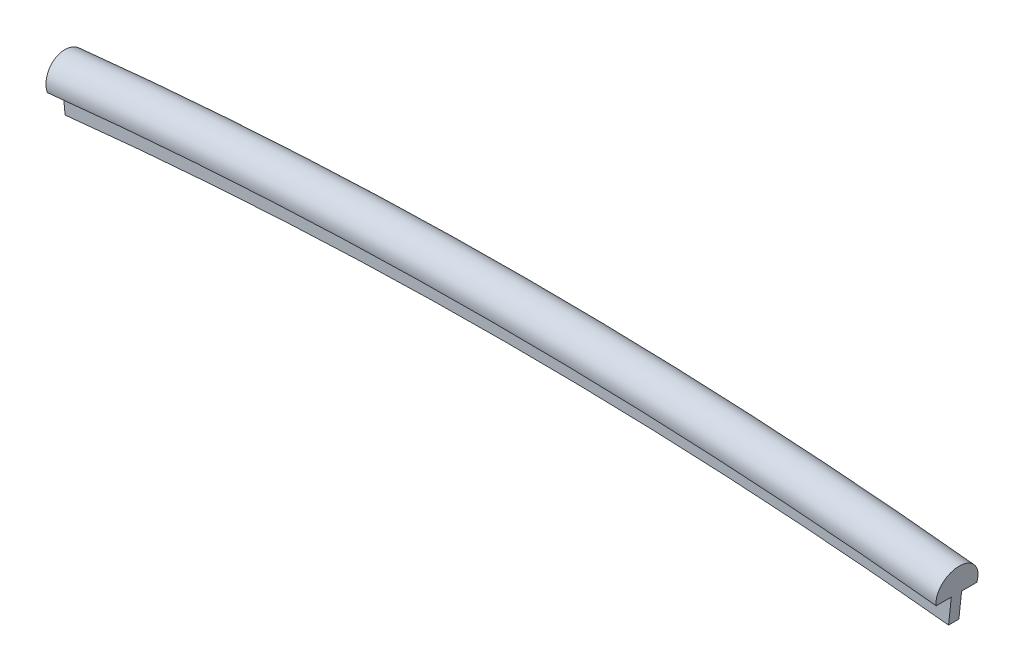
ISO-10303-21;
HEADER;
FILE_DESCRIPTION(('STEP AP214'),'2;1');
FILE_NAME('part.step','',(''),(''),'','','');
FILE_SCHEMA(('AUTOMOTIVE_DESIGN { 1 0 10303 214 1 1 1 1 }'));
ENDSEC;
DATA;
#1=APPLICATION_CONTEXT('core data for automotive mechanical design processes');
#2=APPLICATION_PROTOCOL_DEFINITION('international standard','automotive_design',2000,#1);
#3=PRODUCT_CONTEXT('',#1,'mechanical');
#4=PRODUCT('Part','Part','',(#3));
#5=PRODUCT_RELATED_PRODUCT_CATEGORY('part','',(#4));
#6=PRODUCT_DEFINITION_FORMATION('','',#4);
#7=PRODUCT_DEFINITION_CONTEXT('part definition',#1,'design');
#8=PRODUCT_DEFINITION('design','',#6,#7);
#9=PRODUCT_DEFINITION_SHAPE('','',#8);
#10=(LENGTH_UNIT() NAMED_UNIT(*) SI_UNIT(.MILLI.,.METRE.));
#11=(NAMED_UNIT(*) PLANE_ANGLE_UNIT() SI_UNIT($,.RADIAN.));
#12=(NAMED_UNIT(*) SI_UNIT($,.STERADIAN.) SOLID_ANGLE_UNIT());
#13=UNCERTAINTY_MEASURE_WITH_UNIT(LENGTH_MEASURE(1.E-05),#10,'distance_accuracy_value','');
#14=(GEOMETRIC_REPRESENTATION_CONTEXT(3) GLOBAL_UNCERTAINTY_ASSIGNED_CONTEXT((#13)) GLOBAL_UNIT_ASSIGNED_CONTEXT((#10,
#11,#12)) REPRESENTATION_CONTEXT('',''));
#15=CARTESIAN_POINT('',(0.,0.,0.));
#16=DIRECTION('',(0.,0.,1.));
#17=DIRECTION('',(1.,0.,0.));
#18=AXIS2_PLACEMENT_3D('',#15,#16,#17);
#19=CARTESIAN_POINT('',(0.,0.,70.5976415970385));
#20=DIRECTION('',(0.,0.,1.));
#21=DIRECTION('',(1.,0.,0.));
#22=AXIS2_PLACEMENT_3D('',#19,#20,#21);
#23=CYLINDRICAL_SURFACE('',#22,241.3);
#24=CARTESIAN_POINT('',(0.,0.,1.18));
#25=DIRECTION('',(0.,0.,1.));
#26=DIRECTION('',(1.,0.,0.));
#27=AXIS2_PLACEMENT_3D('',#24,#25,#26);
#28=CIRCLE('',#27,241.3);
#29=CARTESIAN_POINT('',(25.8304336729898,239.913481689265,1.18));
#30=VERTEX_POINT('',#29);
#31=CARTESIAN_POINT('',(-25.8304336729898,239.913481689265,1.18));
#32=VERTEX_POINT('',#31);
#33=EDGE_CURVE('E11',#30,#32,#28,.T.);
#34=ORIENTED_EDGE('',*,*,#33,.T.);
#35=DIRECTION('',(0.,0.,-1.));
#36=VECTOR('',#35,1.);
#37=CARTESIAN_POINT('',(-25.8304336729898,239.913481689265,1.18));
#38=LINE('',#37,#36);
#39=CARTESIAN_POINT('',(-25.8304336729898,239.913481689265,0.3));
#40=VERTEX_POINT('',#39);
#41=EDGE_CURVE('E103',#32,#40,#38,.T.);
#42=ORIENTED_EDGE('',*,*,#41,.T.);
#43=CARTESIAN_POINT('',(0.,0.,0.299999999999995));
#44=DIRECTION('',(0.,0.,1.));
#45=DIRECTION('',(1.,0.,0.));
#46=AXIS2_PLACEMENT_3D('',#43,#44,#45);
#47=CIRCLE('',#46,241.3);
#48=CARTESIAN_POINT('',(25.8304336729898,239.913481689265,0.3));
#49=VERTEX_POINT('',#48);
#50=EDGE_CURVE('E85',#49,#40,#47,.T.);
#51=ORIENTED_EDGE('',*,*,#50,.F.);
#52=DIRECTION('',(0.,0.,-1.));
#53=VECTOR('',#52,1.);
#54=CARTESIAN_POINT('',(25.8304336729898,239.913481689265,1.18));
#55=LINE('',#54,#53);
#56=EDGE_CURVE('E117',#30,#49,#55,.T.);
#57=ORIENTED_EDGE('',*,*,#56,.F.);
#58=EDGE_LOOP('',(#34,#42,#51,#57));
#59=FACE_BOUND('',#58,.T.);
#60=ADVANCED_FACE('F33',(#59),#23,.F.);
#61=CARTESIAN_POINT('',(0.,0.,0.));
#62=DIRECTION('',(0.,0.,1.));
#63=DIRECTION('',(1.,0.,0.));
#64=AXIS2_PLACEMENT_3D('',#61,#62,#63);
#65=TOROIDAL_SURFACE('',#64,241.586013989906,1.21416802890791);
#66=CARTESIAN_POINT('',(0.,0.,-1.18));
#67=DIRECTION('',(0.,0.,1.));
#68=DIRECTION('',(1.,0.,0.));
#69=AXIS2_PLACEMENT_3D('',#66,#67,#68);
#70=CIRCLE('',#69,241.3);
#71=CARTESIAN_POINT('',(25.8304336729898,239.913481689265,-1.18));
#72=VERTEX_POINT('',#71);
#73=CARTESIAN_POINT('',(-25.8304336729898,239.913481689265,-1.18));
#74=VERTEX_POINT('',#73);
#75=EDGE_CURVE('E41',#72,#74,#70,.T.);
#76=ORIENTED_EDGE('',*,*,#75,.T.);
#77=CARTESIAN_POINT('',(-25.8610506037641,240.197852232697,0.));
#78=DIRECTION('',(0.994253964729652,0.107046969220845,0.));
#79=DIRECTION('',(0.,0.,1.));
#80=AXIS2_PLACEMENT_3D('',#77,#78,#79);
#81=CIRCLE('',#80,1.21416802890791);
#82=EDGE_CURVE('E115',#74,#32,#81,.T.);
#83=ORIENTED_EDGE('',*,*,#82,.T.);
#84=ORIENTED_EDGE('',*,*,#33,.F.);
#85=CARTESIAN_POINT('',(25.8610506037641,240.197852232697,0.));
#86=DIRECTION('',(0.994253964729652,-0.107046969220845,0.));
#87=DIRECTION('',(0.,0.,1.));
#88=AXIS2_PLACEMENT_3D('',#85,#86,#87);
#89=CIRCLE('',#88,1.21416802890791);
#90=EDGE_CURVE('E97',#72,#30,#89,.T.);
#91=ORIENTED_EDGE('',*,*,#90,.F.);
#92=EDGE_LOOP('',(#76,#83,#84,#91));
#93=FACE_BOUND('',#92,.T.);
#94=ADVANCED_FACE('F35',(#93),#65,.T.);
#95=CARTESIAN_POINT('',(0.,0.,70.5976415970385));
#96=DIRECTION('',(0.,0.,1.));
#97=DIRECTION('',(1.,0.,0.));
#98=AXIS2_PLACEMENT_3D('',#95,#96,#97);
#99=CYLINDRICAL_SURFACE('',#98,241.3);
#100=CARTESIAN_POINT('',(0.,0.,-0.299999999999995));
#101=DIRECTION('',(0.,0.,1.));
#102=DIRECTION('',(1.,0.,0.));
#103=AXIS2_PLACEMENT_3D('',#100,#101,#102);
#104=CIRCLE('',#103,241.3);
#105=CARTESIAN_POINT('',(25.8304336729898,239.913481689265,-0.3));
#106=VERTEX_POINT('',#105);
#107=CARTESIAN_POINT('',(-25.8304336729898,239.913481689265,-0.3));
#108=VERTEX_POINT('',#107);
#109=EDGE_CURVE('E132',#106,#108,#104,.T.);
#110=ORIENTED_EDGE('',*,*,#109,.T.);
#111=DIRECTION('',(0.,0.,-1.));
#112=VECTOR('',#111,1.);
#113=CARTESIAN_POINT('',(-25.8304336729898,239.913481689265,-0.3));
#114=LINE('',#113,#112);
#115=EDGE_CURVE('E113',#108,#74,#114,.T.);
#116=ORIENTED_EDGE('',*,*,#115,.T.);
#117=ORIENTED_EDGE('',*,*,#75,.F.);
#118=DIRECTION('',(0.,0.,-1.));
#119=VECTOR('',#118,1.);
#120=CARTESIAN_POINT('',(25.8304336729898,239.913481689265,-0.3));
#121=LINE('',#120,#119);
#122=EDGE_CURVE('E125',#106,#72,#121,.T.);
#123=ORIENTED_EDGE('',*,*,#122,.F.);
#124=EDGE_LOOP('',(#110,#116,#117,#123));
#125=FACE_BOUND('',#124,.T.);
#126=ADVANCED_FACE('F134',(#125),#99,.F.);
#127=CARTESIAN_POINT('',(25.6698632191586,238.422100742171,-0.3));
#128=DIRECTION('',(0.,0.,1.));
#129=DIRECTION('',(1.,0.,0.));
#130=AXIS2_PLACEMENT_3D('',#127,#128,#129);
#131=PLANE('',#130);
#132=CARTESIAN_POINT('',(0.,0.,-0.299999999999995));
#133=DIRECTION('',(0.,0.,1.));
#134=DIRECTION('',(1.,0.,0.));
#135=AXIS2_PLACEMENT_3D('',#132,#133,#134);
#136=CIRCLE('',#135,239.8);
#137=CARTESIAN_POINT('',(25.6698632191586,238.422100742171,-0.3));
#138=VERTEX_POINT('',#137);
#139=CARTESIAN_POINT('',(-25.6698632191586,238.422100742171,-0.3));
#140=VERTEX_POINT('',#139);
#141=EDGE_CURVE('E129',#138,#140,#136,.T.);
#142=ORIENTED_EDGE('',*,*,#141,.T.);
#143=DIRECTION('',(-0.107046969220845,0.994253964729652,0.));
#144=VECTOR('',#143,1.);
#145=CARTESIAN_POINT('',(-25.6698632191586,238.422100742171,-0.3));
#146=LINE('',#145,#144);
#147=EDGE_CURVE('E110',#140,#108,#146,.T.);
#148=ORIENTED_EDGE('',*,*,#147,.T.);
#149=ORIENTED_EDGE('',*,*,#109,.F.);
#150=DIRECTION('',(0.107046969220845,0.994253964729652,0.));
#151=VECTOR('',#150,1.);
#152=CARTESIAN_POINT('',(25.6698632191586,238.422100742171,-0.3));
#153=LINE('',#152,#151);
#154=EDGE_CURVE('E122',#138,#106,#153,.T.);
#155=ORIENTED_EDGE('',*,*,#154,.F.);
#156=EDGE_LOOP('',(#142,#148,#149,#155));
#157=FACE_BOUND('',#156,.T.);
#158=ADVANCED_FACE('F136',(#157),#131,.F.);
#159=CARTESIAN_POINT('',(0.,0.,70.5976415970385));
#160=DIRECTION('',(0.,0.,1.));
#161=DIRECTION('',(1.,0.,0.));
#162=AXIS2_PLACEMENT_3D('',#159,#160,#161);
#163=CYLINDRICAL_SURFACE('',#162,239.8);
#164=CARTESIAN_POINT('',(0.,0.,0.299999999999995));
#165=DIRECTION('',(0.,0.,1.));
#166=DIRECTION('',(1.,0.,0.));
#167=AXIS2_PLACEMENT_3D('',#164,#165,#166);
#168=CIRCLE('',#167,239.8);
#169=CARTESIAN_POINT('',(25.6698632191586,238.422100742171,0.3));
#170=VERTEX_POINT('',#169);
#171=CARTESIAN_POINT('',(-25.6698632191586,238.422100742171,0.3));
#172=VERTEX_POINT('',#171);
#173=EDGE_CURVE('E96',#170,#172,#168,.T.);
#174=ORIENTED_EDGE('',*,*,#173,.T.);
#175=DIRECTION('',(0.,0.,-1.));
#176=VECTOR('',#175,1.);
#177=CARTESIAN_POINT('',(-25.6698632191586,238.422100742171,0.));
#178=LINE('',#177,#176);
#179=EDGE_CURVE('E105',#172,#140,#178,.T.);
#180=ORIENTED_EDGE('',*,*,#179,.T.);
#181=ORIENTED_EDGE('',*,*,#141,.F.);
#182=DIRECTION('',(0.,0.,-1.));
#183=VECTOR('',#182,1.);
#184=CARTESIAN_POINT('',(25.6698632191586,238.422100742171,0.));
#185=LINE('',#184,#183);
#186=EDGE_CURVE('E120',#170,#138,#185,.T.);
#187=ORIENTED_EDGE('',*,*,#186,.F.);
#188=EDGE_LOOP('',(#174,#180,#181,#187));
#189=FACE_BOUND('',#188,.T.);
#190=ADVANCED_FACE('F141',(#189),#163,.F.);
#191=CARTESIAN_POINT('',(25.6698632191586,238.422100742171,0.3));
#192=DIRECTION('',(0.,0.,-1.));
#193=DIRECTION('',(-1.,0.,0.));
#194=AXIS2_PLACEMENT_3D('',#191,#192,#193);
#195=PLANE('',#194);
#196=DIRECTION('',(-0.107046969220845,-0.994253964729652,0.));
#197=VECTOR('',#196,1.);
#198=CARTESIAN_POINT('',(25.6698632191586,238.422100742171,0.3));
#199=LINE('',#198,#197);
#200=EDGE_CURVE('E91',#49,#170,#199,.T.);
#201=ORIENTED_EDGE('',*,*,#200,.F.);
#202=ORIENTED_EDGE('',*,*,#50,.T.);
#203=DIRECTION('',(0.107046969220845,-0.994253964729652,0.));
#204=VECTOR('',#203,1.);
#205=CARTESIAN_POINT('',(-25.6698632191586,238.422100742171,0.3));
#206=LINE('',#205,#204);
#207=EDGE_CURVE('E88',#40,#172,#206,.T.);
#208=ORIENTED_EDGE('',*,*,#207,.T.);
#209=ORIENTED_EDGE('',*,*,#173,.F.);
#210=EDGE_LOOP('',(#201,#202,#208,#209));
#211=FACE_BOUND('',#210,.T.);
#212=ADVANCED_FACE('F87',(#211),#195,.F.);
#213=CARTESIAN_POINT('',(25.8610506037641,240.197852232697,0.));
#214=DIRECTION('',(-0.994253964729652,0.107046969220845,0.));
#215=DIRECTION('',(0.,0.,1.));
#216=AXIS2_PLACEMENT_3D('',#213,#214,#215);
#217=PLANE('',#216);
#218=ORIENTED_EDGE('',*,*,#56,.T.);
#219=ORIENTED_EDGE('',*,*,#200,.T.);
#220=ORIENTED_EDGE('',*,*,#186,.T.);
#221=ORIENTED_EDGE('',*,*,#154,.T.);
#222=ORIENTED_EDGE('',*,*,#122,.T.);
#223=ORIENTED_EDGE('',*,*,#90,.T.);
#224=EDGE_LOOP('',(#218,#219,#220,#221,#222,#223));
#225=FACE_BOUND('',#224,.T.);
#226=ADVANCED_FACE('F143',(#225),#217,.F.);
#227=CARTESIAN_POINT('',(-25.8610506037641,240.197852232697,0.));
#228=DIRECTION('',(-0.994253964729652,-0.107046969220845,0.));
#229=DIRECTION('',(0.,0.,1.));
#230=AXIS2_PLACEMENT_3D('',#227,#228,#229);
#231=PLANE('',#230);
#232=ORIENTED_EDGE('',*,*,#41,.F.);
#233=ORIENTED_EDGE('',*,*,#82,.F.);
#234=ORIENTED_EDGE('',*,*,#115,.F.);
#235=ORIENTED_EDGE('',*,*,#147,.F.);
#236=ORIENTED_EDGE('',*,*,#179,.F.);
#237=ORIENTED_EDGE('',*,*,#207,.F.);
#238=EDGE_LOOP('',(#232,#233,#234,#235,#236,#237));
#239=FACE_BOUND('',#238,.T.);
#240=ADVANCED_FACE('F101',(#239),#231,.T.);
#241=CLOSED_SHELL('',(#60,#94,#126,#158,#190,#212,#226,#240));
#242=MANIFOLD_SOLID_BREP('B2',#241);
#243=ADVANCED_BREP_SHAPE_REPRESENTATION('',(#18,#242),#14);
#244=SHAPE_DEFINITION_REPRESENTATION(#9,#243);
ENDSEC;
END-ISO-10303-21;
